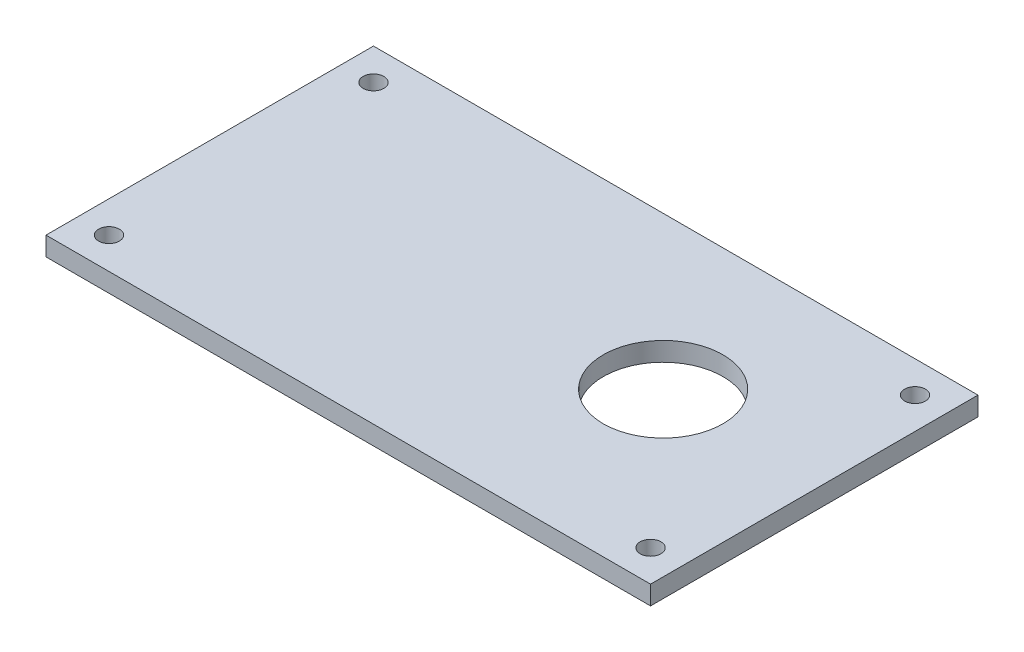
ISO-10303-21;
HEADER;
FILE_DESCRIPTION(('STEP AP214'),'2;1');
FILE_NAME('part.step','',(''),(''),'','','');
FILE_SCHEMA(('AUTOMOTIVE_DESIGN { 1 0 10303 214 1 1 1 1 }'));
ENDSEC;
DATA;
#1=APPLICATION_CONTEXT('core data for automotive mechanical design processes');
#2=APPLICATION_PROTOCOL_DEFINITION('international standard','automotive_design',2000,#1);
#3=PRODUCT_CONTEXT('',#1,'mechanical');
#4=PRODUCT('Part','Part','',(#3));
#5=PRODUCT_RELATED_PRODUCT_CATEGORY('part','',(#4));
#6=PRODUCT_DEFINITION_FORMATION('','',#4);
#7=PRODUCT_DEFINITION_CONTEXT('part definition',#1,'design');
#8=PRODUCT_DEFINITION('design','',#6,#7);
#9=PRODUCT_DEFINITION_SHAPE('','',#8);
#10=(LENGTH_UNIT() NAMED_UNIT(*) SI_UNIT(.MILLI.,.METRE.));
#11=(NAMED_UNIT(*) PLANE_ANGLE_UNIT() SI_UNIT($,.RADIAN.));
#12=(NAMED_UNIT(*) SI_UNIT($,.STERADIAN.) SOLID_ANGLE_UNIT());
#13=UNCERTAINTY_MEASURE_WITH_UNIT(LENGTH_MEASURE(1.E-05),#10,'distance_accuracy_value','');
#14=(GEOMETRIC_REPRESENTATION_CONTEXT(3) GLOBAL_UNCERTAINTY_ASSIGNED_CONTEXT((#13)) GLOBAL_UNIT_ASSIGNED_CONTEXT((#10,
#11,#12)) REPRESENTATION_CONTEXT('',''));
#15=CARTESIAN_POINT('',(0.,0.,0.));
#16=DIRECTION('',(0.,0.,1.));
#17=DIRECTION('',(1.,0.,0.));
#18=AXIS2_PLACEMENT_3D('',#15,#16,#17);
#19=CARTESIAN_POINT('',(-48.,3.,-26.));
#20=DIRECTION('',(1.,0.,0.));
#21=DIRECTION('',(0.,0.,-1.));
#22=AXIS2_PLACEMENT_3D('',#19,#20,#21);
#23=PLANE('',#22);
#24=DIRECTION('',(0.,0.,1.));
#25=VECTOR('',#24,1.);
#26=CARTESIAN_POINT('',(-48.,0.,-26.));
#27=LINE('',#26,#25);
#28=CARTESIAN_POINT('',(-48.,0.,-26.));
#29=VERTEX_POINT('',#28);
#30=CARTESIAN_POINT('',(-48.,0.,26.));
#31=VERTEX_POINT('',#30);
#32=EDGE_CURVE('E96',#29,#31,#27,.T.);
#33=ORIENTED_EDGE('',*,*,#32,.T.);
#34=DIRECTION('',(0.,-1.,0.));
#35=VECTOR('',#34,1.);
#36=CARTESIAN_POINT('',(-48.,3.,26.));
#37=LINE('',#36,#35);
#38=CARTESIAN_POINT('',(-48.,3.,26.));
#39=VERTEX_POINT('',#38);
#40=EDGE_CURVE('E11',#39,#31,#37,.T.);
#41=ORIENTED_EDGE('',*,*,#40,.F.);
#42=DIRECTION('',(0.,0.,1.));
#43=VECTOR('',#42,1.);
#44=CARTESIAN_POINT('',(-48.,3.,-26.));
#45=LINE('',#44,#43);
#46=CARTESIAN_POINT('',(-48.,3.,-26.));
#47=VERTEX_POINT('',#46);
#48=EDGE_CURVE('E84',#47,#39,#45,.T.);
#49=ORIENTED_EDGE('',*,*,#48,.F.);
#50=DIRECTION('',(0.,-1.,0.));
#51=VECTOR('',#50,1.);
#52=CARTESIAN_POINT('',(-48.,3.,-26.));
#53=LINE('',#52,#51);
#54=EDGE_CURVE('E92',#47,#29,#53,.T.);
#55=ORIENTED_EDGE('',*,*,#54,.T.);
#56=EDGE_LOOP('',(#33,#41,#49,#55));
#57=FACE_BOUND('',#56,.T.);
#58=ADVANCED_FACE('F33',(#57),#23,.F.);
#59=CARTESIAN_POINT('',(-48.,3.,26.));
#60=DIRECTION('',(0.,0.,-1.));
#61=DIRECTION('',(-1.,0.,0.));
#62=AXIS2_PLACEMENT_3D('',#59,#60,#61);
#63=PLANE('',#62);
#64=DIRECTION('',(1.,0.,0.));
#65=VECTOR('',#64,1.);
#66=CARTESIAN_POINT('',(-48.,0.,26.));
#67=LINE('',#66,#65);
#68=CARTESIAN_POINT('',(48.,0.,26.));
#69=VERTEX_POINT('',#68);
#70=EDGE_CURVE('E88',#31,#69,#67,.T.);
#71=ORIENTED_EDGE('',*,*,#70,.T.);
#72=DIRECTION('',(0.,-1.,0.));
#73=VECTOR('',#72,1.);
#74=CARTESIAN_POINT('',(48.,3.,26.));
#75=LINE('',#74,#73);
#76=CARTESIAN_POINT('',(48.,3.,26.));
#77=VERTEX_POINT('',#76);
#78=EDGE_CURVE('E41',#77,#69,#75,.T.);
#79=ORIENTED_EDGE('',*,*,#78,.F.);
#80=DIRECTION('',(1.,0.,0.));
#81=VECTOR('',#80,1.);
#82=CARTESIAN_POINT('',(-48.,3.,26.));
#83=LINE('',#82,#81);
#84=EDGE_CURVE('E79',#39,#77,#83,.T.);
#85=ORIENTED_EDGE('',*,*,#84,.F.);
#86=ORIENTED_EDGE('',*,*,#40,.T.);
#87=EDGE_LOOP('',(#71,#79,#85,#86));
#88=FACE_BOUND('',#87,.T.);
#89=ADVANCED_FACE('F87',(#88),#63,.F.);
#90=CARTESIAN_POINT('',(48.,3.,-26.));
#91=DIRECTION('',(-1.,0.,0.));
#92=DIRECTION('',(0.,0.,1.));
#93=AXIS2_PLACEMENT_3D('',#90,#91,#92);
#94=PLANE('',#93);
#95=DIRECTION('',(0.,0.,-1.));
#96=VECTOR('',#95,1.);
#97=CARTESIAN_POINT('',(48.,0.,-26.));
#98=LINE('',#97,#96);
#99=CARTESIAN_POINT('',(48.,0.,-26.));
#100=VERTEX_POINT('',#99);
#101=EDGE_CURVE('E66',#69,#100,#98,.T.);
#102=ORIENTED_EDGE('',*,*,#101,.T.);
#103=DIRECTION('',(0.,-1.,0.));
#104=VECTOR('',#103,1.);
#105=CARTESIAN_POINT('',(48.,3.,-26.));
#106=LINE('',#105,#104);
#107=CARTESIAN_POINT('',(48.,3.,-26.));
#108=VERTEX_POINT('',#107);
#109=EDGE_CURVE('E89',#108,#100,#106,.T.);
#110=ORIENTED_EDGE('',*,*,#109,.F.);
#111=DIRECTION('',(0.,0.,-1.));
#112=VECTOR('',#111,1.);
#113=CARTESIAN_POINT('',(48.,3.,-26.));
#114=LINE('',#113,#112);
#115=EDGE_CURVE('E82',#77,#108,#114,.T.);
#116=ORIENTED_EDGE('',*,*,#115,.F.);
#117=ORIENTED_EDGE('',*,*,#78,.T.);
#118=EDGE_LOOP('',(#102,#110,#116,#117));
#119=FACE_BOUND('',#118,.T.);
#120=ADVANCED_FACE('F90',(#119),#94,.F.);
#121=CARTESIAN_POINT('',(-48.,3.,-26.));
#122=DIRECTION('',(0.,0.,1.));
#123=DIRECTION('',(1.,0.,0.));
#124=AXIS2_PLACEMENT_3D('',#121,#122,#123);
#125=PLANE('',#124);
#126=DIRECTION('',(-1.,0.,0.));
#127=VECTOR('',#126,1.);
#128=CARTESIAN_POINT('',(-48.,0.,-26.));
#129=LINE('',#128,#127);
#130=EDGE_CURVE('E72',#100,#29,#129,.T.);
#131=ORIENTED_EDGE('',*,*,#130,.T.);
#132=ORIENTED_EDGE('',*,*,#54,.F.);
#133=DIRECTION('',(-1.,0.,0.));
#134=VECTOR('',#133,1.);
#135=CARTESIAN_POINT('',(-48.,3.,-26.));
#136=LINE('',#135,#134);
#137=EDGE_CURVE('E49',#108,#47,#136,.T.);
#138=ORIENTED_EDGE('',*,*,#137,.F.);
#139=ORIENTED_EDGE('',*,*,#109,.T.);
#140=EDGE_LOOP('',(#131,#132,#138,#139));
#141=FACE_BOUND('',#140,.T.);
#142=ADVANCED_FACE('F104',(#141),#125,.F.);
#143=CARTESIAN_POINT('',(0.,3.,0.));
#144=DIRECTION('',(0.,1.,0.));
#145=DIRECTION('',(0.,0.,1.));
#146=AXIS2_PLACEMENT_3D('',#143,#144,#145);
#147=PLANE('',#146);
#148=CARTESIAN_POINT('',(-42.9999999999996,3.,21.));
#149=DIRECTION('',(0.,1.,0.));
#150=DIRECTION('',(0.,0.,1.));
#151=AXIS2_PLACEMENT_3D('',#148,#149,#150);
#152=CIRCLE('',#151,1.65);
#153=CARTESIAN_POINT('',(-42.9999999999996,3.,22.65));
#154=VERTEX_POINT('',#153);
#155=EDGE_CURVE('E134',#154,#154,#152,.T.);
#156=ORIENTED_EDGE('',*,*,#155,.F.);
#157=EDGE_LOOP('',(#156));
#158=FACE_BOUND('',#157,.T.);
#159=CARTESIAN_POINT('',(43.0000000000004,3.,21.));
#160=DIRECTION('',(0.,1.,0.));
#161=DIRECTION('',(0.,0.,1.));
#162=AXIS2_PLACEMENT_3D('',#159,#160,#161);
#163=CIRCLE('',#162,1.65);
#164=CARTESIAN_POINT('',(43.0000000000004,3.,22.65));
#165=VERTEX_POINT('',#164);
#166=EDGE_CURVE('E128',#165,#165,#163,.T.);
#167=ORIENTED_EDGE('',*,*,#166,.F.);
#168=EDGE_LOOP('',(#167));
#169=FACE_BOUND('',#168,.T.);
#170=CARTESIAN_POINT('',(43.,3.,-21.));
#171=DIRECTION('',(0.,1.,0.));
#172=DIRECTION('',(0.,0.,1.));
#173=AXIS2_PLACEMENT_3D('',#170,#171,#172);
#174=CIRCLE('',#173,1.65);
#175=CARTESIAN_POINT('',(43.,3.,-19.35));
#176=VERTEX_POINT('',#175);
#177=EDGE_CURVE('E122',#176,#176,#174,.T.);
#178=ORIENTED_EDGE('',*,*,#177,.F.);
#179=EDGE_LOOP('',(#178));
#180=FACE_BOUND('',#179,.T.);
#181=CARTESIAN_POINT('',(22.2,3.,-1.8));
#182=DIRECTION('',(0.,1.,0.));
#183=DIRECTION('',(0.,0.,1.));
#184=AXIS2_PLACEMENT_3D('',#181,#182,#183);
#185=CIRCLE('',#184,9.5);
#186=CARTESIAN_POINT('',(22.2,3.,7.7));
#187=VERTEX_POINT('',#186);
#188=EDGE_CURVE('E116',#187,#187,#185,.T.);
#189=ORIENTED_EDGE('',*,*,#188,.F.);
#190=EDGE_LOOP('',(#189));
#191=FACE_BOUND('',#190,.T.);
#192=CARTESIAN_POINT('',(-43.,3.,-21.));
#193=DIRECTION('',(0.,1.,0.));
#194=DIRECTION('',(0.,0.,1.));
#195=AXIS2_PLACEMENT_3D('',#192,#193,#194);
#196=CIRCLE('',#195,1.65);
#197=CARTESIAN_POINT('',(-43.,3.,-19.35));
#198=VERTEX_POINT('',#197);
#199=EDGE_CURVE('E110',#198,#198,#196,.T.);
#200=ORIENTED_EDGE('',*,*,#199,.F.);
#201=EDGE_LOOP('',(#200));
#202=FACE_BOUND('',#201,.T.);
#203=ORIENTED_EDGE('',*,*,#48,.T.);
#204=ORIENTED_EDGE('',*,*,#84,.T.);
#205=ORIENTED_EDGE('',*,*,#115,.T.);
#206=ORIENTED_EDGE('',*,*,#137,.T.);
#207=EDGE_LOOP('',(#203,#204,#205,#206));
#208=FACE_BOUND('',#207,.T.);
#209=ADVANCED_FACE('F80',(#158,#169,#180,#191,#202,#208),#147,.T.);
#210=CARTESIAN_POINT('',(0.,0.,0.));
#211=DIRECTION('',(0.,1.,0.));
#212=DIRECTION('',(0.,0.,1.));
#213=AXIS2_PLACEMENT_3D('',#210,#211,#212);
#214=PLANE('',#213);
#215=CARTESIAN_POINT('',(-42.9999999999996,0.,21.));
#216=DIRECTION('',(0.,1.,0.));
#217=DIRECTION('',(0.,0.,1.));
#218=AXIS2_PLACEMENT_3D('',#215,#216,#217);
#219=CIRCLE('',#218,1.65);
#220=CARTESIAN_POINT('',(-42.9999999999996,0.,22.65));
#221=VERTEX_POINT('',#220);
#222=EDGE_CURVE('E131',#221,#221,#219,.T.);
#223=ORIENTED_EDGE('',*,*,#222,.T.);
#224=EDGE_LOOP('',(#223));
#225=FACE_BOUND('',#224,.T.);
#226=CARTESIAN_POINT('',(43.0000000000004,0.,21.));
#227=DIRECTION('',(0.,1.,0.));
#228=DIRECTION('',(0.,0.,1.));
#229=AXIS2_PLACEMENT_3D('',#226,#227,#228);
#230=CIRCLE('',#229,1.65);
#231=CARTESIAN_POINT('',(43.0000000000004,0.,22.65));
#232=VERTEX_POINT('',#231);
#233=EDGE_CURVE('E125',#232,#232,#230,.T.);
#234=ORIENTED_EDGE('',*,*,#233,.T.);
#235=EDGE_LOOP('',(#234));
#236=FACE_BOUND('',#235,.T.);
#237=CARTESIAN_POINT('',(43.,0.,-21.));
#238=DIRECTION('',(0.,1.,0.));
#239=DIRECTION('',(0.,0.,1.));
#240=AXIS2_PLACEMENT_3D('',#237,#238,#239);
#241=CIRCLE('',#240,1.65);
#242=CARTESIAN_POINT('',(43.,0.,-19.35));
#243=VERTEX_POINT('',#242);
#244=EDGE_CURVE('E119',#243,#243,#241,.T.);
#245=ORIENTED_EDGE('',*,*,#244,.T.);
#246=EDGE_LOOP('',(#245));
#247=FACE_BOUND('',#246,.T.);
#248=CARTESIAN_POINT('',(22.2,0.,-1.8));
#249=DIRECTION('',(0.,1.,0.));
#250=DIRECTION('',(0.,0.,1.));
#251=AXIS2_PLACEMENT_3D('',#248,#249,#250);
#252=CIRCLE('',#251,9.5);
#253=CARTESIAN_POINT('',(22.2,0.,7.7));
#254=VERTEX_POINT('',#253);
#255=EDGE_CURVE('E113',#254,#254,#252,.T.);
#256=ORIENTED_EDGE('',*,*,#255,.T.);
#257=EDGE_LOOP('',(#256));
#258=FACE_BOUND('',#257,.T.);
#259=CARTESIAN_POINT('',(-43.,0.,-21.));
#260=DIRECTION('',(0.,1.,0.));
#261=DIRECTION('',(0.,0.,1.));
#262=AXIS2_PLACEMENT_3D('',#259,#260,#261);
#263=CIRCLE('',#262,1.65);
#264=CARTESIAN_POINT('',(-43.,0.,-19.35));
#265=VERTEX_POINT('',#264);
#266=EDGE_CURVE('E99',#265,#265,#263,.T.);
#267=ORIENTED_EDGE('',*,*,#266,.T.);
#268=EDGE_LOOP('',(#267));
#269=FACE_BOUND('',#268,.T.);
#270=ORIENTED_EDGE('',*,*,#32,.F.);
#271=ORIENTED_EDGE('',*,*,#130,.F.);
#272=ORIENTED_EDGE('',*,*,#101,.F.);
#273=ORIENTED_EDGE('',*,*,#70,.F.);
#274=EDGE_LOOP('',(#270,#271,#272,#273));
#275=FACE_BOUND('',#274,.T.);
#276=ADVANCED_FACE('F107',(#225,#236,#247,#258,#269,#275),#214,.F.);
#277=CARTESIAN_POINT('',(-43.,0.,-21.));
#278=DIRECTION('',(0.,1.,0.));
#279=DIRECTION('',(0.,0.,1.));
#280=AXIS2_PLACEMENT_3D('',#277,#278,#279);
#281=CYLINDRICAL_SURFACE('',#280,1.65);
#282=ORIENTED_EDGE('',*,*,#266,.F.);
#283=EDGE_LOOP('',(#282));
#284=FACE_BOUND('',#283,.T.);
#285=ORIENTED_EDGE('',*,*,#199,.T.);
#286=EDGE_LOOP('',(#285));
#287=FACE_BOUND('',#286,.T.);
#288=ADVANCED_FACE('F160',(#284,#287),#281,.F.);
#289=CARTESIAN_POINT('',(22.2,0.,-1.8));
#290=DIRECTION('',(0.,1.,0.));
#291=DIRECTION('',(0.,0.,1.));
#292=AXIS2_PLACEMENT_3D('',#289,#290,#291);
#293=CYLINDRICAL_SURFACE('',#292,9.5);
#294=ORIENTED_EDGE('',*,*,#255,.F.);
#295=EDGE_LOOP('',(#294));
#296=FACE_BOUND('',#295,.T.);
#297=ORIENTED_EDGE('',*,*,#188,.T.);
#298=EDGE_LOOP('',(#297));
#299=FACE_BOUND('',#298,.T.);
#300=ADVANCED_FACE('F162',(#296,#299),#293,.F.);
#301=CARTESIAN_POINT('',(43.,0.,-21.));
#302=DIRECTION('',(0.,1.,0.));
#303=DIRECTION('',(0.,0.,1.));
#304=AXIS2_PLACEMENT_3D('',#301,#302,#303);
#305=CYLINDRICAL_SURFACE('',#304,1.65);
#306=ORIENTED_EDGE('',*,*,#244,.F.);
#307=EDGE_LOOP('',(#306));
#308=FACE_BOUND('',#307,.T.);
#309=ORIENTED_EDGE('',*,*,#177,.T.);
#310=EDGE_LOOP('',(#309));
#311=FACE_BOUND('',#310,.T.);
#312=ADVANCED_FACE('F169',(#308,#311),#305,.F.);
#313=CARTESIAN_POINT('',(43.0000000000004,0.,21.));
#314=DIRECTION('',(0.,1.,0.));
#315=DIRECTION('',(0.,0.,1.));
#316=AXIS2_PLACEMENT_3D('',#313,#314,#315);
#317=CYLINDRICAL_SURFACE('',#316,1.65);
#318=ORIENTED_EDGE('',*,*,#233,.F.);
#319=EDGE_LOOP('',(#318));
#320=FACE_BOUND('',#319,.T.);
#321=ORIENTED_EDGE('',*,*,#166,.T.);
#322=EDGE_LOOP('',(#321));
#323=FACE_BOUND('',#322,.T.);
#324=ADVANCED_FACE('F145',(#320,#323),#317,.F.);
#325=CARTESIAN_POINT('',(-42.9999999999996,0.,21.));
#326=DIRECTION('',(0.,1.,0.));
#327=DIRECTION('',(0.,0.,1.));
#328=AXIS2_PLACEMENT_3D('',#325,#326,#327);
#329=CYLINDRICAL_SURFACE('',#328,1.65);
#330=ORIENTED_EDGE('',*,*,#222,.F.);
#331=EDGE_LOOP('',(#330));
#332=FACE_BOUND('',#331,.T.);
#333=ORIENTED_EDGE('',*,*,#155,.T.);
#334=EDGE_LOOP('',(#333));
#335=FACE_BOUND('',#334,.T.);
#336=ADVANCED_FACE('F142',(#332,#335),#329,.F.);
#337=CLOSED_SHELL('',(#58,#89,#120,#142,#209,#276,#288,#300,#312,#324,#336));
#338=MANIFOLD_SOLID_BREP('B2',#337);
#339=ADVANCED_BREP_SHAPE_REPRESENTATION('',(#18,#338),#14);
#340=SHAPE_DEFINITION_REPRESENTATION(#9,#339);
ENDSEC;
END-ISO-10303-21;
